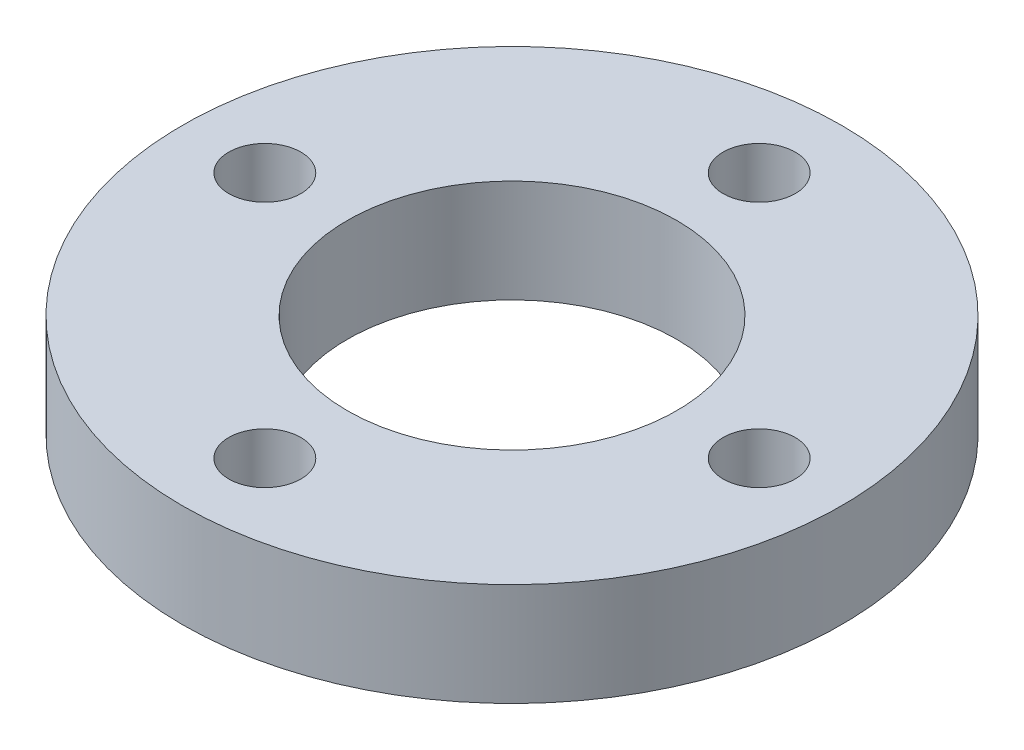
ISO-10303-21;
HEADER;
FILE_DESCRIPTION(('STEP AP214'),'2;1');
FILE_NAME('part.step','',(''),(''),'','','');
FILE_SCHEMA(('AUTOMOTIVE_DESIGN { 1 0 10303 214 1 1 1 1 }'));
ENDSEC;
DATA;
#1=APPLICATION_CONTEXT('core data for automotive mechanical design processes');
#2=APPLICATION_PROTOCOL_DEFINITION('international standard','automotive_design',2000,#1);
#3=PRODUCT_CONTEXT('',#1,'mechanical');
#4=PRODUCT('Part','Part','',(#3));
#5=PRODUCT_RELATED_PRODUCT_CATEGORY('part','',(#4));
#6=PRODUCT_DEFINITION_FORMATION('','',#4);
#7=PRODUCT_DEFINITION_CONTEXT('part definition',#1,'design');
#8=PRODUCT_DEFINITION('design','',#6,#7);
#9=PRODUCT_DEFINITION_SHAPE('','',#8);
#10=(LENGTH_UNIT() NAMED_UNIT(*) SI_UNIT(.MILLI.,.METRE.));
#11=(NAMED_UNIT(*) PLANE_ANGLE_UNIT() SI_UNIT($,.RADIAN.));
#12=(NAMED_UNIT(*) SI_UNIT($,.STERADIAN.) SOLID_ANGLE_UNIT());
#13=UNCERTAINTY_MEASURE_WITH_UNIT(LENGTH_MEASURE(1.E-05),#10,'distance_accuracy_value','');
#14=(GEOMETRIC_REPRESENTATION_CONTEXT(3) GLOBAL_UNCERTAINTY_ASSIGNED_CONTEXT((#13)) GLOBAL_UNIT_ASSIGNED_CONTEXT((#10,
#11,#12)) REPRESENTATION_CONTEXT('',''));
#15=CARTESIAN_POINT('',(0.,0.,0.));
#16=DIRECTION('',(0.,0.,1.));
#17=DIRECTION('',(1.,0.,0.));
#18=AXIS2_PLACEMENT_3D('',#15,#16,#17);
#19=CARTESIAN_POINT('',(0.,5.,0.));
#20=DIRECTION('',(0.,1.,0.));
#21=DIRECTION('',(0.,0.,1.));
#22=AXIS2_PLACEMENT_3D('',#19,#20,#21);
#23=PLANE('',#22);
#24=CARTESIAN_POINT('',(-12.,5.,0.));
#25=DIRECTION('',(0.,1.,0.));
#26=DIRECTION('',(0.,0.,1.));
#27=AXIS2_PLACEMENT_3D('',#24,#25,#26);
#28=CIRCLE('',#27,1.75);
#29=CARTESIAN_POINT('',(-12.,5.,1.74999999999992));
#30=VERTEX_POINT('',#29);
#31=EDGE_CURVE('E61',#30,#30,#28,.T.);
#32=ORIENTED_EDGE('',*,*,#31,.F.);
#33=EDGE_LOOP('',(#32));
#34=FACE_BOUND('',#33,.T.);
#35=CARTESIAN_POINT('',(12.,5.,0.));
#36=DIRECTION('',(0.,1.,0.));
#37=DIRECTION('',(0.,0.,1.));
#38=AXIS2_PLACEMENT_3D('',#35,#36,#37);
#39=CIRCLE('',#38,1.75);
#40=CARTESIAN_POINT('',(12.,5.,1.75));
#41=VERTEX_POINT('',#40);
#42=EDGE_CURVE('E49',#41,#41,#39,.T.);
#43=ORIENTED_EDGE('',*,*,#42,.F.);
#44=EDGE_LOOP('',(#43));
#45=FACE_BOUND('',#44,.T.);
#46=CARTESIAN_POINT('',(0.,5.,0.));
#47=DIRECTION('',(0.,1.,0.));
#48=DIRECTION('',(0.,0.,1.));
#49=AXIS2_PLACEMENT_3D('',#46,#47,#48);
#50=CIRCLE('',#49,16.);
#51=CARTESIAN_POINT('',(0.,5.,16.));
#52=VERTEX_POINT('',#51);
#53=EDGE_CURVE('E10',#52,#52,#50,.T.);
#54=ORIENTED_EDGE('',*,*,#53,.T.);
#55=EDGE_LOOP('',(#54));
#56=FACE_BOUND('',#55,.T.);
#57=CARTESIAN_POINT('',(0.,5.,0.));
#58=DIRECTION('',(0.,1.,0.));
#59=DIRECTION('',(0.,0.,1.));
#60=AXIS2_PLACEMENT_3D('',#57,#58,#59);
#61=CIRCLE('',#60,8.);
#62=CARTESIAN_POINT('',(0.,5.,8.));
#63=VERTEX_POINT('',#62);
#64=EDGE_CURVE('E44',#63,#63,#61,.T.);
#65=ORIENTED_EDGE('',*,*,#64,.F.);
#66=EDGE_LOOP('',(#65));
#67=FACE_BOUND('',#66,.T.);
#68=CARTESIAN_POINT('',(0.,5.,12.));
#69=DIRECTION('',(0.,1.,0.));
#70=DIRECTION('',(0.,0.,1.));
#71=AXIS2_PLACEMENT_3D('',#68,#69,#70);
#72=CIRCLE('',#71,1.75);
#73=CARTESIAN_POINT('',(0.,5.,13.75));
#74=VERTEX_POINT('',#73);
#75=EDGE_CURVE('E55',#74,#74,#72,.T.);
#76=ORIENTED_EDGE('',*,*,#75,.F.);
#77=EDGE_LOOP('',(#76));
#78=FACE_BOUND('',#77,.T.);
#79=CARTESIAN_POINT('',(1.25693328198353E-13,5.,-12.));
#80=DIRECTION('',(0.,1.,0.));
#81=DIRECTION('',(0.,0.,1.));
#82=AXIS2_PLACEMENT_3D('',#79,#80,#81);
#83=CIRCLE('',#82,1.75);
#84=CARTESIAN_POINT('',(1.25693328198353E-13,5.,-10.25));
#85=VERTEX_POINT('',#84);
#86=EDGE_CURVE('E67',#85,#85,#83,.T.);
#87=ORIENTED_EDGE('',*,*,#86,.F.);
#88=EDGE_LOOP('',(#87));
#89=FACE_BOUND('',#88,.T.);
#90=ADVANCED_FACE('F33',(#34,#45,#56,#67,#78,#89),#23,.T.);
#91=CARTESIAN_POINT('',(0.,0.,0.));
#92=DIRECTION('',(0.,1.,0.));
#93=DIRECTION('',(0.,0.,1.));
#94=AXIS2_PLACEMENT_3D('',#91,#92,#93);
#95=PLANE('',#94);
#96=CARTESIAN_POINT('',(0.,0.,0.));
#97=DIRECTION('',(0.,1.,0.));
#98=DIRECTION('',(0.,0.,1.));
#99=AXIS2_PLACEMENT_3D('',#96,#97,#98);
#100=CIRCLE('',#99,16.);
#101=CARTESIAN_POINT('',(0.,0.,16.));
#102=VERTEX_POINT('',#101);
#103=EDGE_CURVE('E37',#102,#102,#100,.T.);
#104=ORIENTED_EDGE('',*,*,#103,.F.);
#105=EDGE_LOOP('',(#104));
#106=FACE_BOUND('',#105,.T.);
#107=CARTESIAN_POINT('',(0.,0.,0.));
#108=DIRECTION('',(0.,1.,0.));
#109=DIRECTION('',(0.,0.,1.));
#110=AXIS2_PLACEMENT_3D('',#107,#108,#109);
#111=CIRCLE('',#110,8.);
#112=CARTESIAN_POINT('',(0.,0.,8.));
#113=VERTEX_POINT('',#112);
#114=EDGE_CURVE('E46',#113,#113,#111,.T.);
#115=ORIENTED_EDGE('',*,*,#114,.T.);
#116=EDGE_LOOP('',(#115));
#117=FACE_BOUND('',#116,.T.);
#118=CARTESIAN_POINT('',(12.,0.,0.));
#119=DIRECTION('',(0.,1.,0.));
#120=DIRECTION('',(0.,0.,1.));
#121=AXIS2_PLACEMENT_3D('',#118,#119,#120);
#122=CIRCLE('',#121,1.75);
#123=CARTESIAN_POINT('',(12.,0.,1.75));
#124=VERTEX_POINT('',#123);
#125=EDGE_CURVE('E52',#124,#124,#122,.T.);
#126=ORIENTED_EDGE('',*,*,#125,.T.);
#127=EDGE_LOOP('',(#126));
#128=FACE_BOUND('',#127,.T.);
#129=CARTESIAN_POINT('',(0.,0.,12.));
#130=DIRECTION('',(0.,1.,0.));
#131=DIRECTION('',(0.,0.,1.));
#132=AXIS2_PLACEMENT_3D('',#129,#130,#131);
#133=CIRCLE('',#132,1.75);
#134=CARTESIAN_POINT('',(0.,0.,13.75));
#135=VERTEX_POINT('',#134);
#136=EDGE_CURVE('E58',#135,#135,#133,.T.);
#137=ORIENTED_EDGE('',*,*,#136,.T.);
#138=EDGE_LOOP('',(#137));
#139=FACE_BOUND('',#138,.T.);
#140=CARTESIAN_POINT('',(-12.,0.,0.));
#141=DIRECTION('',(0.,1.,0.));
#142=DIRECTION('',(0.,0.,1.));
#143=AXIS2_PLACEMENT_3D('',#140,#141,#142);
#144=CIRCLE('',#143,1.75);
#145=CARTESIAN_POINT('',(-12.,0.,1.74999999999992));
#146=VERTEX_POINT('',#145);
#147=EDGE_CURVE('E64',#146,#146,#144,.T.);
#148=ORIENTED_EDGE('',*,*,#147,.T.);
#149=EDGE_LOOP('',(#148));
#150=FACE_BOUND('',#149,.T.);
#151=CARTESIAN_POINT('',(1.25693328198353E-13,0.,-12.));
#152=DIRECTION('',(0.,1.,0.));
#153=DIRECTION('',(0.,0.,1.));
#154=AXIS2_PLACEMENT_3D('',#151,#152,#153);
#155=CIRCLE('',#154,1.75);
#156=CARTESIAN_POINT('',(1.25693328198353E-13,0.,-10.25));
#157=VERTEX_POINT('',#156);
#158=EDGE_CURVE('E70',#157,#157,#155,.T.);
#159=ORIENTED_EDGE('',*,*,#158,.T.);
#160=EDGE_LOOP('',(#159));
#161=FACE_BOUND('',#160,.T.);
#162=ADVANCED_FACE('F80',(#106,#117,#128,#139,#150,#161),#95,.F.);
#163=CARTESIAN_POINT('',(0.,5.,0.));
#164=DIRECTION('',(0.,-1.,0.));
#165=DIRECTION('',(0.,0.,-1.));
#166=AXIS2_PLACEMENT_3D('',#163,#164,#165);
#167=CYLINDRICAL_SURFACE('',#166,16.);
#168=ORIENTED_EDGE('',*,*,#53,.F.);
#169=EDGE_LOOP('',(#168));
#170=FACE_BOUND('',#169,.T.);
#171=ORIENTED_EDGE('',*,*,#103,.T.);
#172=EDGE_LOOP('',(#171));
#173=FACE_BOUND('',#172,.T.);
#174=ADVANCED_FACE('F35',(#170,#173),#167,.T.);
#175=CARTESIAN_POINT('',(0.,5.,0.));
#176=DIRECTION('',(0.,-1.,0.));
#177=DIRECTION('',(0.,0.,-1.));
#178=AXIS2_PLACEMENT_3D('',#175,#176,#177);
#179=CYLINDRICAL_SURFACE('',#178,8.);
#180=ORIENTED_EDGE('',*,*,#64,.T.);
#181=EDGE_LOOP('',(#180));
#182=FACE_BOUND('',#181,.T.);
#183=ORIENTED_EDGE('',*,*,#114,.F.);
#184=EDGE_LOOP('',(#183));
#185=FACE_BOUND('',#184,.T.);
#186=ADVANCED_FACE('F90',(#182,#185),#179,.F.);
#187=CARTESIAN_POINT('',(12.,5.,0.));
#188=DIRECTION('',(0.,-1.,0.));
#189=DIRECTION('',(0.,0.,-1.));
#190=AXIS2_PLACEMENT_3D('',#187,#188,#189);
#191=CYLINDRICAL_SURFACE('',#190,1.75);
#192=ORIENTED_EDGE('',*,*,#42,.T.);
#193=EDGE_LOOP('',(#192));
#194=FACE_BOUND('',#193,.T.);
#195=ORIENTED_EDGE('',*,*,#125,.F.);
#196=EDGE_LOOP('',(#195));
#197=FACE_BOUND('',#196,.T.);
#198=ADVANCED_FACE('F93',(#194,#197),#191,.F.);
#199=CARTESIAN_POINT('',(0.,5.,12.));
#200=DIRECTION('',(0.,-1.,0.));
#201=DIRECTION('',(0.,0.,-1.));
#202=AXIS2_PLACEMENT_3D('',#199,#200,#201);
#203=CYLINDRICAL_SURFACE('',#202,1.75);
#204=ORIENTED_EDGE('',*,*,#75,.T.);
#205=EDGE_LOOP('',(#204));
#206=FACE_BOUND('',#205,.T.);
#207=ORIENTED_EDGE('',*,*,#136,.F.);
#208=EDGE_LOOP('',(#207));
#209=FACE_BOUND('',#208,.T.);
#210=ADVANCED_FACE('F97',(#206,#209),#203,.F.);
#211=CARTESIAN_POINT('',(-12.,5.,0.));
#212=DIRECTION('',(0.,-1.,0.));
#213=DIRECTION('',(0.,0.,-1.));
#214=AXIS2_PLACEMENT_3D('',#211,#212,#213);
#215=CYLINDRICAL_SURFACE('',#214,1.75);
#216=ORIENTED_EDGE('',*,*,#31,.T.);
#217=EDGE_LOOP('',(#216));
#218=FACE_BOUND('',#217,.T.);
#219=ORIENTED_EDGE('',*,*,#147,.F.);
#220=EDGE_LOOP('',(#219));
#221=FACE_BOUND('',#220,.T.);
#222=ADVANCED_FACE('F101',(#218,#221),#215,.F.);
#223=CARTESIAN_POINT('',(1.25693328198353E-13,5.,-12.));
#224=DIRECTION('',(0.,-1.,0.));
#225=DIRECTION('',(0.,0.,-1.));
#226=AXIS2_PLACEMENT_3D('',#223,#224,#225);
#227=CYLINDRICAL_SURFACE('',#226,1.75);
#228=ORIENTED_EDGE('',*,*,#86,.T.);
#229=EDGE_LOOP('',(#228));
#230=FACE_BOUND('',#229,.T.);
#231=ORIENTED_EDGE('',*,*,#158,.F.);
#232=EDGE_LOOP('',(#231));
#233=FACE_BOUND('',#232,.T.);
#234=ADVANCED_FACE('F76',(#230,#233),#227,.F.);
#235=CLOSED_SHELL('',(#90,#162,#174,#186,#198,#210,#222,#234));
#236=MANIFOLD_SOLID_BREP('B2',#235);
#237=ADVANCED_BREP_SHAPE_REPRESENTATION('',(#18,#236),#14);
#238=SHAPE_DEFINITION_REPRESENTATION(#9,#237);
ENDSEC;
END-ISO-10303-21;
